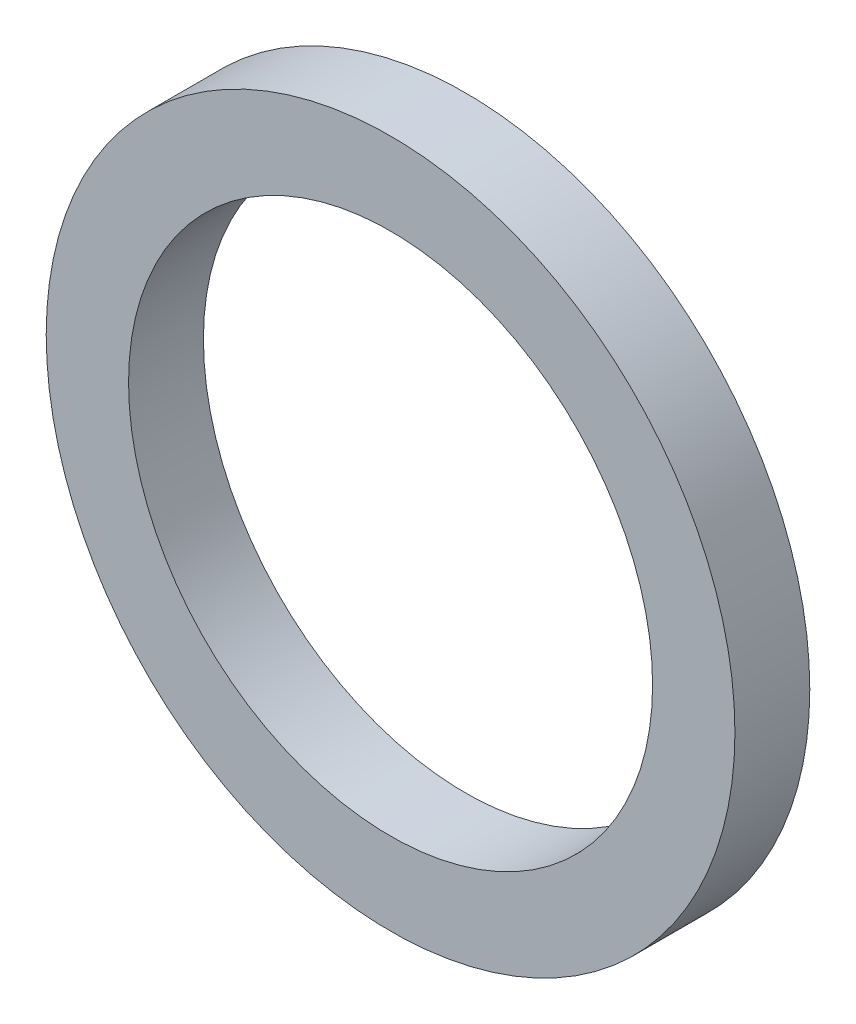
ISO-10303-21;
HEADER;
FILE_DESCRIPTION(('STEP AP214'),'2;1');
FILE_NAME('part.step','',(''),(''),'','','');
FILE_SCHEMA(('AUTOMOTIVE_DESIGN { 1 0 10303 214 1 1 1 1 }'));
ENDSEC;
DATA;
#1=APPLICATION_CONTEXT('core data for automotive mechanical design processes');
#2=APPLICATION_PROTOCOL_DEFINITION('international standard','automotive_design',2000,#1);
#3=PRODUCT_CONTEXT('',#1,'mechanical');
#4=PRODUCT('Part','Part','',(#3));
#5=PRODUCT_RELATED_PRODUCT_CATEGORY('part','',(#4));
#6=PRODUCT_DEFINITION_FORMATION('','',#4);
#7=PRODUCT_DEFINITION_CONTEXT('part definition',#1,'design');
#8=PRODUCT_DEFINITION('design','',#6,#7);
#9=PRODUCT_DEFINITION_SHAPE('','',#8);
#10=(LENGTH_UNIT() NAMED_UNIT(*) SI_UNIT(.MILLI.,.METRE.));
#11=(NAMED_UNIT(*) PLANE_ANGLE_UNIT() SI_UNIT($,.RADIAN.));
#12=(NAMED_UNIT(*) SI_UNIT($,.STERADIAN.) SOLID_ANGLE_UNIT());
#13=UNCERTAINTY_MEASURE_WITH_UNIT(LENGTH_MEASURE(1.E-05),#10,'distance_accuracy_value','');
#14=(GEOMETRIC_REPRESENTATION_CONTEXT(3) GLOBAL_UNCERTAINTY_ASSIGNED_CONTEXT((#13)) GLOBAL_UNIT_ASSIGNED_CONTEXT((#10,
#11,#12)) REPRESENTATION_CONTEXT('',''));
#15=CARTESIAN_POINT('',(0.,0.,0.));
#16=DIRECTION('',(0.,0.,1.));
#17=DIRECTION('',(1.,0.,0.));
#18=AXIS2_PLACEMENT_3D('',#15,#16,#17);
#19=CARTESIAN_POINT('',(0.,0.,10.));
#20=DIRECTION('',(0.,0.,1.));
#21=DIRECTION('',(1.,0.,0.));
#22=AXIS2_PLACEMENT_3D('',#19,#20,#21);
#23=PLANE('',#22);
#24=CARTESIAN_POINT('',(0.,0.,10.));
#25=DIRECTION('',(0.,0.,1.));
#26=DIRECTION('',(1.,0.,0.));
#27=AXIS2_PLACEMENT_3D('',#24,#25,#26);
#28=CIRCLE('',#27,46.);
#29=CARTESIAN_POINT('',(46.,0.,10.));
#30=VERTEX_POINT('',#29);
#31=EDGE_CURVE('E10',#30,#30,#28,.T.);
#32=ORIENTED_EDGE('',*,*,#31,.T.);
#33=EDGE_LOOP('',(#32));
#34=FACE_BOUND('',#33,.T.);
#35=CARTESIAN_POINT('',(0.,0.,10.));
#36=DIRECTION('',(0.,0.,1.));
#37=DIRECTION('',(1.,0.,0.));
#38=AXIS2_PLACEMENT_3D('',#35,#36,#37);
#39=CIRCLE('',#38,35.);
#40=CARTESIAN_POINT('',(35.,0.,10.));
#41=VERTEX_POINT('',#40);
#42=EDGE_CURVE('E52',#41,#41,#39,.T.);
#43=ORIENTED_EDGE('',*,*,#42,.F.);
#44=EDGE_LOOP('',(#43));
#45=FACE_BOUND('',#44,.T.);
#46=ADVANCED_FACE('F36',(#34,#45),#23,.T.);
#47=CARTESIAN_POINT('',(0.,0.,0.));
#48=DIRECTION('',(0.,0.,1.));
#49=DIRECTION('',(1.,0.,0.));
#50=AXIS2_PLACEMENT_3D('',#47,#48,#49);
#51=PLANE('',#50);
#52=CARTESIAN_POINT('',(0.,0.,0.));
#53=DIRECTION('',(0.,0.,1.));
#54=DIRECTION('',(1.,0.,0.));
#55=AXIS2_PLACEMENT_3D('',#52,#53,#54);
#56=CIRCLE('',#55,46.);
#57=CARTESIAN_POINT('',(46.,0.,0.));
#58=VERTEX_POINT('',#57);
#59=EDGE_CURVE('E40',#58,#58,#56,.T.);
#60=ORIENTED_EDGE('',*,*,#59,.F.);
#61=EDGE_LOOP('',(#60));
#62=FACE_BOUND('',#61,.T.);
#63=CARTESIAN_POINT('',(0.,0.,0.));
#64=DIRECTION('',(0.,0.,1.));
#65=DIRECTION('',(1.,0.,0.));
#66=AXIS2_PLACEMENT_3D('',#63,#64,#65);
#67=CIRCLE('',#66,35.);
#68=CARTESIAN_POINT('',(35.,0.,0.));
#69=VERTEX_POINT('',#68);
#70=EDGE_CURVE('E54',#69,#69,#67,.T.);
#71=ORIENTED_EDGE('',*,*,#70,.T.);
#72=EDGE_LOOP('',(#71));
#73=FACE_BOUND('',#72,.T.);
#74=ADVANCED_FACE('F64',(#62,#73),#51,.F.);
#75=CARTESIAN_POINT('',(0.,0.,10.));
#76=DIRECTION('',(0.,0.,-1.));
#77=DIRECTION('',(-1.,0.,0.));
#78=AXIS2_PLACEMENT_3D('',#75,#76,#77);
#79=CYLINDRICAL_SURFACE('',#78,46.);
#80=ORIENTED_EDGE('',*,*,#31,.F.);
#81=EDGE_LOOP('',(#80));
#82=FACE_BOUND('',#81,.T.);
#83=ORIENTED_EDGE('',*,*,#59,.T.);
#84=EDGE_LOOP('',(#83));
#85=FACE_BOUND('',#84,.T.);
#86=ADVANCED_FACE('F38',(#82,#85),#79,.T.);
#87=CARTESIAN_POINT('',(0.,0.,10.));
#88=DIRECTION('',(0.,0.,-1.));
#89=DIRECTION('',(-1.,0.,0.));
#90=AXIS2_PLACEMENT_3D('',#87,#88,#89);
#91=CYLINDRICAL_SURFACE('',#90,35.);
#92=ORIENTED_EDGE('',*,*,#42,.T.);
#93=EDGE_LOOP('',(#92));
#94=FACE_BOUND('',#93,.T.);
#95=ORIENTED_EDGE('',*,*,#70,.F.);
#96=EDGE_LOOP('',(#95));
#97=FACE_BOUND('',#96,.T.);
#98=ADVANCED_FACE('F60',(#94,#97),#91,.F.);
#99=CLOSED_SHELL('',(#46,#74,#86,#98));
#100=MANIFOLD_SOLID_BREP('B2',#99);
#101=ADVANCED_BREP_SHAPE_REPRESENTATION('',(#18,#100),#14);
#102=SHAPE_DEFINITION_REPRESENTATION(#9,#101);
ENDSEC;
END-ISO-10303-21;
